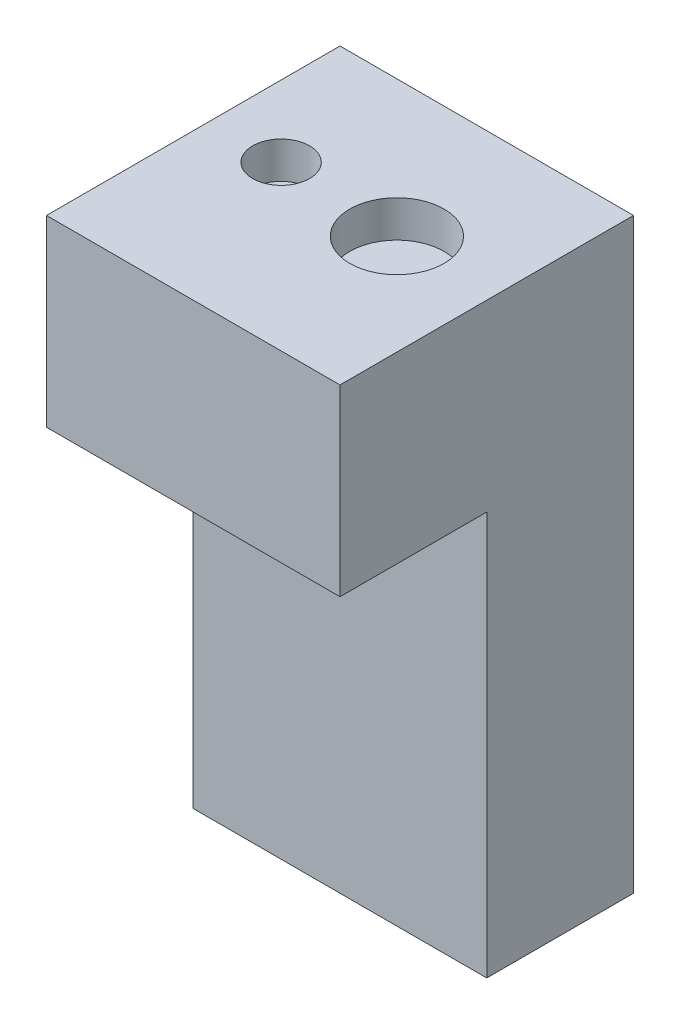
ISO-10303-21;
HEADER;
FILE_DESCRIPTION(('STEP AP214'),'2;1');
FILE_NAME('part.step','',(''),(''),'','','');
FILE_SCHEMA(('AUTOMOTIVE_DESIGN { 1 0 10303 214 1 1 1 1 }'));
ENDSEC;
DATA;
#1=APPLICATION_CONTEXT('core data for automotive mechanical design processes');
#2=APPLICATION_PROTOCOL_DEFINITION('international standard','automotive_design',2000,#1);
#3=PRODUCT_CONTEXT('',#1,'mechanical');
#4=PRODUCT('Part','Part','',(#3));
#5=PRODUCT_RELATED_PRODUCT_CATEGORY('part','',(#4));
#6=PRODUCT_DEFINITION_FORMATION('','',#4);
#7=PRODUCT_DEFINITION_CONTEXT('part definition',#1,'design');
#8=PRODUCT_DEFINITION('design','',#6,#7);
#9=PRODUCT_DEFINITION_SHAPE('','',#8);
#10=(LENGTH_UNIT() NAMED_UNIT(*) SI_UNIT(.MILLI.,.METRE.));
#11=(NAMED_UNIT(*) PLANE_ANGLE_UNIT() SI_UNIT($,.RADIAN.));
#12=(NAMED_UNIT(*) SI_UNIT($,.STERADIAN.) SOLID_ANGLE_UNIT());
#13=UNCERTAINTY_MEASURE_WITH_UNIT(LENGTH_MEASURE(1.E-05),#10,'distance_accuracy_value','');
#14=(GEOMETRIC_REPRESENTATION_CONTEXT(3) GLOBAL_UNCERTAINTY_ASSIGNED_CONTEXT((#13)) GLOBAL_UNIT_ASSIGNED_CONTEXT((#10,
#11,#12)) REPRESENTATION_CONTEXT('',''));
#15=CARTESIAN_POINT('',(0.,0.,0.));
#16=DIRECTION('',(0.,0.,1.));
#17=DIRECTION('',(1.,0.,0.));
#18=AXIS2_PLACEMENT_3D('',#15,#16,#17);
#19=CARTESIAN_POINT('',(0.,0.,20.));
#20=DIRECTION('',(0.,0.,-1.));
#21=DIRECTION('',(-1.,0.,0.));
#22=AXIS2_PLACEMENT_3D('',#19,#20,#21);
#23=PLANE('',#22);
#24=DIRECTION('',(1.,0.,0.));
#25=VECTOR('',#24,1.);
#26=CARTESIAN_POINT('',(-20.,15.,20.));
#27=LINE('',#26,#25);
#28=CARTESIAN_POINT('',(-20.,15.,20.));
#29=VERTEX_POINT('',#28);
#30=CARTESIAN_POINT('',(20.,15.,20.));
#31=VERTEX_POINT('',#30);
#32=EDGE_CURVE('E51',#29,#31,#27,.T.);
#33=ORIENTED_EDGE('',*,*,#32,.F.);
#34=DIRECTION('',(0.,-1.,0.));
#35=VECTOR('',#34,1.);
#36=CARTESIAN_POINT('',(-20.,-40.,20.));
#37=LINE('',#36,#35);
#38=CARTESIAN_POINT('',(-20.,-40.,20.));
#39=VERTEX_POINT('',#38);
#40=EDGE_CURVE('E137',#29,#39,#37,.T.);
#41=ORIENTED_EDGE('',*,*,#40,.T.);
#42=DIRECTION('',(1.,0.,0.));
#43=VECTOR('',#42,1.);
#44=CARTESIAN_POINT('',(-20.,-40.,20.));
#45=LINE('',#44,#43);
#46=CARTESIAN_POINT('',(20.,-40.,20.));
#47=VERTEX_POINT('',#46);
#48=EDGE_CURVE('E57',#39,#47,#45,.T.);
#49=ORIENTED_EDGE('',*,*,#48,.T.);
#50=DIRECTION('',(0.,1.,0.));
#51=VECTOR('',#50,1.);
#52=CARTESIAN_POINT('',(20.,-40.,20.));
#53=LINE('',#52,#51);
#54=EDGE_CURVE('E86',#47,#31,#53,.T.);
#55=ORIENTED_EDGE('',*,*,#54,.T.);
#56=EDGE_LOOP('',(#33,#41,#49,#55));
#57=FACE_BOUND('',#56,.T.);
#58=ADVANCED_FACE('F36',(#57),#23,.F.);
#59=CARTESIAN_POINT('',(20.,-40.,20.));
#60=DIRECTION('',(-1.,0.,0.));
#61=DIRECTION('',(0.,0.,1.));
#62=AXIS2_PLACEMENT_3D('',#59,#60,#61);
#63=PLANE('',#62);
#64=DIRECTION('',(0.,1.,0.));
#65=VECTOR('',#64,1.);
#66=CARTESIAN_POINT('',(20.,-40.,0.));
#67=LINE('',#66,#65);
#68=CARTESIAN_POINT('',(20.,-40.,0.));
#69=VERTEX_POINT('',#68);
#70=CARTESIAN_POINT('',(20.,40.,0.));
#71=VERTEX_POINT('',#70);
#72=EDGE_CURVE('E92',#69,#71,#67,.T.);
#73=ORIENTED_EDGE('',*,*,#72,.T.);
#74=DIRECTION('',(0.,0.,-1.));
#75=VECTOR('',#74,1.);
#76=CARTESIAN_POINT('',(20.,40.,20.));
#77=LINE('',#76,#75);
#78=CARTESIAN_POINT('',(20.,40.,40.));
#79=VERTEX_POINT('',#78);
#80=EDGE_CURVE('E11',#79,#71,#77,.T.);
#81=ORIENTED_EDGE('',*,*,#80,.F.);
#82=DIRECTION('',(0.,1.,0.));
#83=VECTOR('',#82,1.);
#84=CARTESIAN_POINT('',(20.,40.,40.));
#85=LINE('',#84,#83);
#86=CARTESIAN_POINT('',(20.,15.,40.));
#87=VERTEX_POINT('',#86);
#88=EDGE_CURVE('E128',#87,#79,#85,.T.);
#89=ORIENTED_EDGE('',*,*,#88,.F.);
#90=DIRECTION('',(0.,0.,-1.));
#91=VECTOR('',#90,1.);
#92=CARTESIAN_POINT('',(20.,15.,40.));
#93=LINE('',#92,#91);
#94=EDGE_CURVE('E101',#87,#31,#93,.T.);
#95=ORIENTED_EDGE('',*,*,#94,.T.);
#96=ORIENTED_EDGE('',*,*,#54,.F.);
#97=DIRECTION('',(0.,0.,-1.));
#98=VECTOR('',#97,1.);
#99=CARTESIAN_POINT('',(20.,-40.,20.));
#100=LINE('',#99,#98);
#101=EDGE_CURVE('E79',#47,#69,#100,.T.);
#102=ORIENTED_EDGE('',*,*,#101,.T.);
#103=EDGE_LOOP('',(#73,#81,#89,#95,#96,#102));
#104=FACE_BOUND('',#103,.T.);
#105=ADVANCED_FACE('F38',(#104),#63,.F.);
#106=CARTESIAN_POINT('',(-20.,40.,20.));
#107=DIRECTION('',(0.,-1.,0.));
#108=DIRECTION('',(0.,0.,-1.));
#109=AXIS2_PLACEMENT_3D('',#106,#107,#108);
#110=PLANE('',#109);
#111=CARTESIAN_POINT('',(-10.2975725269566,40.,17.7229011833385));
#112=DIRECTION('',(0.,1.,0.));
#113=DIRECTION('',(0.,0.,1.));
#114=AXIS2_PLACEMENT_3D('',#111,#112,#113);
#115=CIRCLE('',#114,3.87339884041489);
#116=CARTESIAN_POINT('',(-10.2975725269566,40.,21.5963000237533));
#117=VERTEX_POINT('',#116);
#118=EDGE_CURVE('E153',#117,#117,#115,.T.);
#119=ORIENTED_EDGE('',*,*,#118,.F.);
#120=EDGE_LOOP('',(#119));
#121=FACE_BOUND('',#120,.T.);
#122=CARTESIAN_POINT('',(6.32970054409263,40.,18.5731594653807));
#123=DIRECTION('',(0.,1.,0.));
#124=DIRECTION('',(0.,0.,1.));
#125=AXIS2_PLACEMENT_3D('',#122,#123,#124);
#126=CIRCLE('',#125,6.42417368654177);
#127=CARTESIAN_POINT('',(6.32970054409263,40.,24.9973331519225));
#128=VERTEX_POINT('',#127);
#129=EDGE_CURVE('E147',#128,#128,#126,.T.);
#130=ORIENTED_EDGE('',*,*,#129,.F.);
#131=EDGE_LOOP('',(#130));
#132=FACE_BOUND('',#131,.T.);
#133=DIRECTION('',(-1.,0.,0.));
#134=VECTOR('',#133,1.);
#135=CARTESIAN_POINT('',(-20.,40.,0.));
#136=LINE('',#135,#134);
#137=CARTESIAN_POINT('',(-20.,40.,0.));
#138=VERTEX_POINT('',#137);
#139=EDGE_CURVE('E96',#71,#138,#136,.T.);
#140=ORIENTED_EDGE('',*,*,#139,.T.);
#141=DIRECTION('',(0.,0.,-1.));
#142=VECTOR('',#141,1.);
#143=CARTESIAN_POINT('',(-20.,40.,20.));
#144=LINE('',#143,#142);
#145=CARTESIAN_POINT('',(-20.,40.,40.));
#146=VERTEX_POINT('',#145);
#147=EDGE_CURVE('E44',#146,#138,#144,.T.);
#148=ORIENTED_EDGE('',*,*,#147,.F.);
#149=DIRECTION('',(-1.,0.,0.));
#150=VECTOR('',#149,1.);
#151=CARTESIAN_POINT('',(-20.,40.,40.));
#152=LINE('',#151,#150);
#153=EDGE_CURVE('E120',#79,#146,#152,.T.);
#154=ORIENTED_EDGE('',*,*,#153,.F.);
#155=ORIENTED_EDGE('',*,*,#80,.T.);
#156=EDGE_LOOP('',(#140,#148,#154,#155));
#157=FACE_BOUND('',#156,.T.);
#158=ADVANCED_FACE('F118',(#121,#132,#157),#110,.F.);
#159=CARTESIAN_POINT('',(-20.,-40.,20.));
#160=DIRECTION('',(1.,0.,0.));
#161=DIRECTION('',(0.,0.,-1.));
#162=AXIS2_PLACEMENT_3D('',#159,#160,#161);
#163=PLANE('',#162);
#164=DIRECTION('',(0.,-1.,0.));
#165=VECTOR('',#164,1.);
#166=CARTESIAN_POINT('',(-20.,-40.,0.));
#167=LINE('',#166,#165);
#168=CARTESIAN_POINT('',(-20.,-40.,0.));
#169=VERTEX_POINT('',#168);
#170=EDGE_CURVE('E87',#138,#169,#167,.T.);
#171=ORIENTED_EDGE('',*,*,#170,.T.);
#172=DIRECTION('',(0.,0.,-1.));
#173=VECTOR('',#172,1.);
#174=CARTESIAN_POINT('',(-20.,-40.,20.));
#175=LINE('',#174,#173);
#176=EDGE_CURVE('E82',#39,#169,#175,.T.);
#177=ORIENTED_EDGE('',*,*,#176,.F.);
#178=ORIENTED_EDGE('',*,*,#40,.F.);
#179=DIRECTION('',(0.,0.,-1.));
#180=VECTOR('',#179,1.);
#181=CARTESIAN_POINT('',(-20.,15.,40.));
#182=LINE('',#181,#180);
#183=CARTESIAN_POINT('',(-20.,15.,40.));
#184=VERTEX_POINT('',#183);
#185=EDGE_CURVE('E97',#184,#29,#182,.T.);
#186=ORIENTED_EDGE('',*,*,#185,.F.);
#187=DIRECTION('',(0.,-1.,0.));
#188=VECTOR('',#187,1.);
#189=CARTESIAN_POINT('',(-20.,40.,40.));
#190=LINE('',#189,#188);
#191=EDGE_CURVE('E114',#146,#184,#190,.T.);
#192=ORIENTED_EDGE('',*,*,#191,.F.);
#193=ORIENTED_EDGE('',*,*,#147,.T.);
#194=EDGE_LOOP('',(#171,#177,#178,#186,#192,#193));
#195=FACE_BOUND('',#194,.T.);
#196=ADVANCED_FACE('F111',(#195),#163,.F.);
#197=CARTESIAN_POINT('',(-20.,-40.,20.));
#198=DIRECTION('',(0.,1.,0.));
#199=DIRECTION('',(0.,0.,1.));
#200=AXIS2_PLACEMENT_3D('',#197,#198,#199);
#201=PLANE('',#200);
#202=DIRECTION('',(1.,0.,0.));
#203=VECTOR('',#202,1.);
#204=CARTESIAN_POINT('',(-20.,-40.,0.));
#205=LINE('',#204,#203);
#206=EDGE_CURVE('E76',#169,#69,#205,.T.);
#207=ORIENTED_EDGE('',*,*,#206,.T.);
#208=ORIENTED_EDGE('',*,*,#101,.F.);
#209=ORIENTED_EDGE('',*,*,#48,.F.);
#210=ORIENTED_EDGE('',*,*,#176,.T.);
#211=EDGE_LOOP('',(#207,#208,#209,#210));
#212=FACE_BOUND('',#211,.T.);
#213=ADVANCED_FACE('F78',(#212),#201,.F.);
#214=CARTESIAN_POINT('',(0.,0.,0.));
#215=DIRECTION('',(0.,0.,-1.));
#216=DIRECTION('',(-1.,0.,0.));
#217=AXIS2_PLACEMENT_3D('',#214,#215,#216);
#218=PLANE('',#217);
#219=ORIENTED_EDGE('',*,*,#72,.F.);
#220=ORIENTED_EDGE('',*,*,#206,.F.);
#221=ORIENTED_EDGE('',*,*,#170,.F.);
#222=ORIENTED_EDGE('',*,*,#139,.F.);
#223=EDGE_LOOP('',(#219,#220,#221,#222));
#224=FACE_BOUND('',#223,.T.);
#225=ADVANCED_FACE('F95',(#224),#218,.T.);
#226=CARTESIAN_POINT('',(-20.,15.,40.));
#227=DIRECTION('',(0.,1.,0.));
#228=DIRECTION('',(0.,0.,1.));
#229=AXIS2_PLACEMENT_3D('',#226,#227,#228);
#230=PLANE('',#229);
#231=ORIENTED_EDGE('',*,*,#32,.T.);
#232=ORIENTED_EDGE('',*,*,#94,.F.);
#233=DIRECTION('',(1.,0.,0.));
#234=VECTOR('',#233,1.);
#235=CARTESIAN_POINT('',(-20.,15.,40.));
#236=LINE('',#235,#234);
#237=EDGE_CURVE('E131',#184,#87,#236,.T.);
#238=ORIENTED_EDGE('',*,*,#237,.F.);
#239=ORIENTED_EDGE('',*,*,#185,.T.);
#240=EDGE_LOOP('',(#231,#232,#238,#239));
#241=FACE_BOUND('',#240,.T.);
#242=ADVANCED_FACE('F140',(#241),#230,.F.);
#243=CARTESIAN_POINT('',(0.,0.,40.));
#244=DIRECTION('',(0.,0.,1.));
#245=DIRECTION('',(1.,0.,0.));
#246=AXIS2_PLACEMENT_3D('',#243,#244,#245);
#247=PLANE('',#246);
#248=ORIENTED_EDGE('',*,*,#191,.T.);
#249=ORIENTED_EDGE('',*,*,#237,.T.);
#250=ORIENTED_EDGE('',*,*,#88,.T.);
#251=ORIENTED_EDGE('',*,*,#153,.T.);
#252=EDGE_LOOP('',(#248,#249,#250,#251));
#253=FACE_BOUND('',#252,.T.);
#254=ADVANCED_FACE('F124',(#253),#247,.T.);
#255=CARTESIAN_POINT('',(6.32970054409263,35.,18.5731594653807));
#256=DIRECTION('',(0.,1.,0.));
#257=DIRECTION('',(0.,0.,1.));
#258=AXIS2_PLACEMENT_3D('',#255,#256,#257);
#259=CYLINDRICAL_SURFACE('',#258,6.42417368654177);
#260=CARTESIAN_POINT('',(6.32970054409263,35.,18.5731594653807));
#261=DIRECTION('',(0.,1.,0.));
#262=DIRECTION('',(0.,0.,1.));
#263=AXIS2_PLACEMENT_3D('',#260,#261,#262);
#264=CIRCLE('',#263,6.42417368654177);
#265=CARTESIAN_POINT('',(6.32970054409263,35.,24.9973331519225));
#266=VERTEX_POINT('',#265);
#267=EDGE_CURVE('E150',#266,#266,#264,.T.);
#268=ORIENTED_EDGE('',*,*,#267,.F.);
#269=EDGE_LOOP('',(#268));
#270=FACE_BOUND('',#269,.T.);
#271=ORIENTED_EDGE('',*,*,#129,.T.);
#272=EDGE_LOOP('',(#271));
#273=FACE_BOUND('',#272,.T.);
#274=ADVANCED_FACE('F172',(#270,#273),#259,.F.);
#275=CARTESIAN_POINT('',(6.32970054409263,35.,18.5731594653807));
#276=DIRECTION('',(0.,1.,0.));
#277=DIRECTION('',(0.,0.,1.));
#278=AXIS2_PLACEMENT_3D('',#275,#276,#277);
#279=PLANE('',#278);
#280=ORIENTED_EDGE('',*,*,#267,.T.);
#281=EDGE_LOOP('',(#280));
#282=FACE_BOUND('',#281,.T.);
#283=ADVANCED_FACE('F164',(#282),#279,.T.);
#284=CARTESIAN_POINT('',(-10.2975725269566,35.,17.7229011833385));
#285=DIRECTION('',(0.,1.,0.));
#286=DIRECTION('',(0.,0.,1.));
#287=AXIS2_PLACEMENT_3D('',#284,#285,#286);
#288=CYLINDRICAL_SURFACE('',#287,3.87339884041489);
#289=CARTESIAN_POINT('',(-10.2975725269566,35.,17.7229011833385));
#290=DIRECTION('',(0.,1.,0.));
#291=DIRECTION('',(0.,0.,1.));
#292=AXIS2_PLACEMENT_3D('',#289,#290,#291);
#293=CIRCLE('',#292,3.87339884041489);
#294=CARTESIAN_POINT('',(-10.2975725269566,35.,21.5963000237533));
#295=VERTEX_POINT('',#294);
#296=EDGE_CURVE('E135',#295,#295,#293,.T.);
#297=ORIENTED_EDGE('',*,*,#296,.F.);
#298=EDGE_LOOP('',(#297));
#299=FACE_BOUND('',#298,.T.);
#300=ORIENTED_EDGE('',*,*,#118,.T.);
#301=EDGE_LOOP('',(#300));
#302=FACE_BOUND('',#301,.T.);
#303=ADVANCED_FACE('F161',(#299,#302),#288,.F.);
#304=CARTESIAN_POINT('',(-10.2975725269566,35.,17.7229011833385));
#305=DIRECTION('',(0.,1.,0.));
#306=DIRECTION('',(0.,0.,1.));
#307=AXIS2_PLACEMENT_3D('',#304,#305,#306);
#308=PLANE('',#307);
#309=ORIENTED_EDGE('',*,*,#296,.T.);
#310=EDGE_LOOP('',(#309));
#311=FACE_BOUND('',#310,.T.);
#312=ADVANCED_FACE('F159',(#311),#308,.T.);
#313=CLOSED_SHELL('',(#58,#105,#158,#196,#213,#225,#242,#254,#274,#283,#303,#312));
#314=MANIFOLD_SOLID_BREP('B2',#313);
#315=ADVANCED_BREP_SHAPE_REPRESENTATION('',(#18,#314),#14);
#316=SHAPE_DEFINITION_REPRESENTATION(#9,#315);
ENDSEC;
END-ISO-10303-21;
